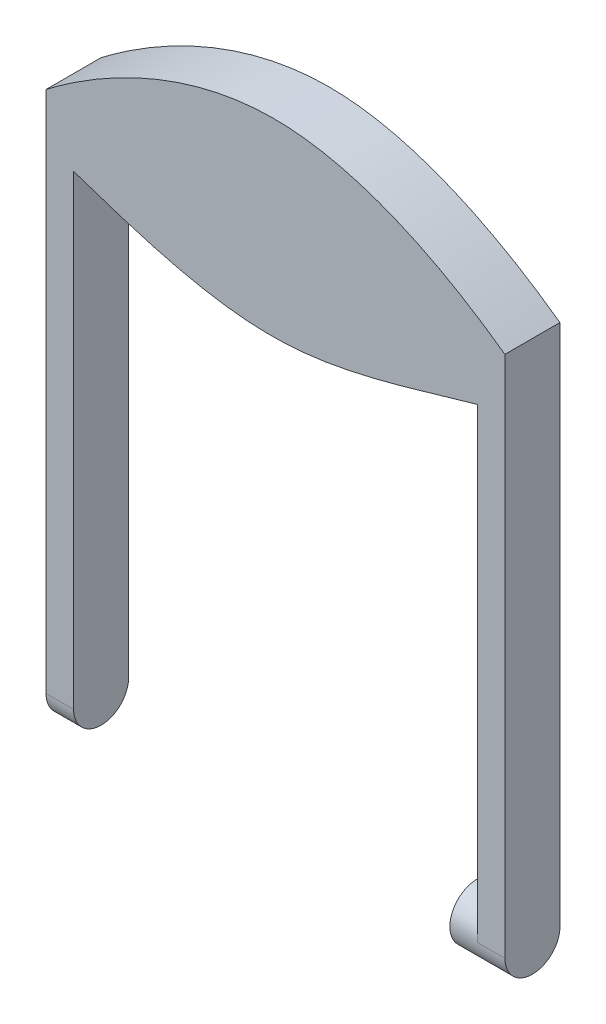
ISO-10303-21;
HEADER;
FILE_DESCRIPTION(('STEP AP214'),'2;1');
FILE_NAME('part.step','',(''),(''),'','','');
FILE_SCHEMA(('AUTOMOTIVE_DESIGN { 1 0 10303 214 1 1 1 1 }'));
ENDSEC;
DATA;
#1=APPLICATION_CONTEXT('core data for automotive mechanical design processes');
#2=APPLICATION_PROTOCOL_DEFINITION('international standard','automotive_design',2000,#1);
#3=PRODUCT_CONTEXT('',#1,'mechanical');
#4=PRODUCT('Part','Part','',(#3));
#5=PRODUCT_RELATED_PRODUCT_CATEGORY('part','',(#4));
#6=PRODUCT_DEFINITION_FORMATION('','',#4);
#7=PRODUCT_DEFINITION_CONTEXT('part definition',#1,'design');
#8=PRODUCT_DEFINITION('design','',#6,#7);
#9=PRODUCT_DEFINITION_SHAPE('','',#8);
#10=(LENGTH_UNIT() NAMED_UNIT(*) SI_UNIT(.MILLI.,.METRE.));
#11=(NAMED_UNIT(*) PLANE_ANGLE_UNIT() SI_UNIT($,.RADIAN.));
#12=(NAMED_UNIT(*) SI_UNIT($,.STERADIAN.) SOLID_ANGLE_UNIT());
#13=UNCERTAINTY_MEASURE_WITH_UNIT(LENGTH_MEASURE(1.E-05),#10,'distance_accuracy_value','');
#14=(GEOMETRIC_REPRESENTATION_CONTEXT(3) GLOBAL_UNCERTAINTY_ASSIGNED_CONTEXT((#13)) GLOBAL_UNIT_ASSIGNED_CONTEXT((#10,
#11,#12)) REPRESENTATION_CONTEXT('',''));
#15=CARTESIAN_POINT('',(0.,0.,0.));
#16=DIRECTION('',(0.,0.,1.));
#17=DIRECTION('',(1.,0.,0.));
#18=AXIS2_PLACEMENT_3D('',#15,#16,#17);
#19=CARTESIAN_POINT('',(2.99999999999999,53.7743661115804,6.));
#20=DIRECTION('',(-1.,0.,0.));
#21=DIRECTION('',(0.,-1.,0.));
#22=AXIS2_PLACEMENT_3D('',#19,#20,#21);
#23=PLANE('',#22);
#24=DIRECTION('',(0.,1.,0.));
#25=VECTOR('',#24,1.);
#26=CARTESIAN_POINT('',(2.99999999999999,53.7743661115804,6.));
#27=LINE('',#26,#25);
#28=CARTESIAN_POINT('',(3.,3.,6.));
#29=VERTEX_POINT('',#28);
#30=CARTESIAN_POINT('',(2.99999999999999,53.7743661115804,6.));
#31=VERTEX_POINT('',#30);
#32=EDGE_CURVE('E153',#29,#31,#27,.T.);
#33=ORIENTED_EDGE('',*,*,#32,.F.);
#34=CARTESIAN_POINT('',(3.,3.,3.));
#35=DIRECTION('',(-1.,0.,0.));
#36=DIRECTION('',(0.,-1.,0.));
#37=AXIS2_PLACEMENT_3D('',#34,#35,#36);
#38=CIRCLE('',#37,3.);
#39=CARTESIAN_POINT('',(3.,3.,0.));
#40=VERTEX_POINT('',#39);
#41=EDGE_CURVE('E110',#40,#29,#38,.T.);
#42=ORIENTED_EDGE('',*,*,#41,.F.);
#43=DIRECTION('',(0.,1.,0.));
#44=VECTOR('',#43,1.);
#45=CARTESIAN_POINT('',(2.99999999999999,53.7743661115804,0.));
#46=LINE('',#45,#44);
#47=CARTESIAN_POINT('',(2.99999999999999,53.7743661115804,0.));
#48=VERTEX_POINT('',#47);
#49=EDGE_CURVE('E133',#40,#48,#46,.T.);
#50=ORIENTED_EDGE('',*,*,#49,.T.);
#51=DIRECTION('',(0.,0.,-1.));
#52=VECTOR('',#51,1.);
#53=CARTESIAN_POINT('',(2.99999999999999,53.7743661115804,6.));
#54=LINE('',#53,#52);
#55=EDGE_CURVE('E160',#31,#48,#54,.T.);
#56=ORIENTED_EDGE('',*,*,#55,.F.);
#57=EDGE_LOOP('',(#33,#42,#50,#56));
#58=FACE_BOUND('',#57,.T.);
#59=ADVANCED_FACE('F38',(#58),#23,.F.);
#60=CARTESIAN_POINT('',(47.,0.,6.));
#61=DIRECTION('',(1.,0.,0.));
#62=DIRECTION('',(0.,0.,-1.));
#63=AXIS2_PLACEMENT_3D('',#60,#61,#62);
#64=PLANE('',#63);
#65=CARTESIAN_POINT('',(47.,3.,3.));
#66=DIRECTION('',(-1.,0.,0.));
#67=DIRECTION('',(0.,-1.,0.));
#68=AXIS2_PLACEMENT_3D('',#65,#66,#67);
#69=CIRCLE('',#68,3.);
#70=CARTESIAN_POINT('',(47.,3.,6.));
#71=VERTEX_POINT('',#70);
#72=CARTESIAN_POINT('',(47.,3.,0.));
#73=VERTEX_POINT('',#72);
#74=EDGE_CURVE('E55',#71,#73,#69,.T.);
#75=ORIENTED_EDGE('',*,*,#74,.F.);
#76=DIRECTION('',(0.,-1.,0.));
#77=VECTOR('',#76,1.);
#78=CARTESIAN_POINT('',(47.,0.,6.));
#79=LINE('',#78,#77);
#80=CARTESIAN_POINT('',(47.,53.7743661115804,6.));
#81=VERTEX_POINT('',#80);
#82=EDGE_CURVE('E182',#81,#71,#79,.T.);
#83=ORIENTED_EDGE('',*,*,#82,.F.);
#84=DIRECTION('',(0.,0.,-1.));
#85=VECTOR('',#84,1.);
#86=CARTESIAN_POINT('',(47.,53.7743661115804,6.));
#87=LINE('',#86,#85);
#88=CARTESIAN_POINT('',(47.,53.7743661115804,0.));
#89=VERTEX_POINT('',#88);
#90=EDGE_CURVE('E157',#81,#89,#87,.T.);
#91=ORIENTED_EDGE('',*,*,#90,.T.);
#92=DIRECTION('',(0.,-1.,0.));
#93=VECTOR('',#92,1.);
#94=CARTESIAN_POINT('',(47.,0.,0.));
#95=LINE('',#94,#93);
#96=EDGE_CURVE('E139',#89,#73,#95,.T.);
#97=ORIENTED_EDGE('',*,*,#96,.T.);
#98=EDGE_LOOP('',(#75,#83,#91,#97));
#99=FACE_BOUND('',#98,.T.);
#100=ADVANCED_FACE('F191',(#99),#64,.F.);
#101=CARTESIAN_POINT('',(50.,60.,6.));
#102=DIRECTION('',(-1.,0.,0.));
#103=DIRECTION('',(0.,-1.,0.));
#104=AXIS2_PLACEMENT_3D('',#101,#102,#103);
#105=PLANE('',#104);
#106=DIRECTION('',(0.,1.,0.));
#107=VECTOR('',#106,1.);
#108=CARTESIAN_POINT('',(50.,60.,6.));
#109=LINE('',#108,#107);
#110=CARTESIAN_POINT('',(50.,3.,6.));
#111=VERTEX_POINT('',#110);
#112=CARTESIAN_POINT('',(50.,60.,6.));
#113=VERTEX_POINT('',#112);
#114=EDGE_CURVE('E126',#111,#113,#109,.T.);
#115=ORIENTED_EDGE('',*,*,#114,.F.);
#116=CARTESIAN_POINT('',(50.,3.,3.));
#117=DIRECTION('',(-1.,0.,0.));
#118=DIRECTION('',(0.,0.,1.));
#119=AXIS2_PLACEMENT_3D('',#116,#117,#118);
#120=CIRCLE('',#119,3.);
#121=CARTESIAN_POINT('',(50.,3.,0.));
#122=VERTEX_POINT('',#121);
#123=EDGE_CURVE('E325',#122,#111,#120,.T.);
#124=ORIENTED_EDGE('',*,*,#123,.F.);
#125=DIRECTION('',(0.,1.,0.));
#126=VECTOR('',#125,1.);
#127=CARTESIAN_POINT('',(50.,60.,0.));
#128=LINE('',#127,#126);
#129=CARTESIAN_POINT('',(50.,60.,0.));
#130=VERTEX_POINT('',#129);
#131=EDGE_CURVE('E144',#122,#130,#128,.T.);
#132=ORIENTED_EDGE('',*,*,#131,.T.);
#133=DIRECTION('',(0.,0.,-1.));
#134=VECTOR('',#133,1.);
#135=CARTESIAN_POINT('',(50.,60.,6.));
#136=LINE('',#135,#134);
#137=EDGE_CURVE('E124',#113,#130,#136,.T.);
#138=ORIENTED_EDGE('',*,*,#137,.F.);
#139=EDGE_LOOP('',(#115,#124,#132,#138));
#140=FACE_BOUND('',#139,.T.);
#141=ADVANCED_FACE('F194',(#140),#105,.F.);
#142=CARTESIAN_POINT('',(0.,0.,6.));
#143=DIRECTION('',(1.,0.,0.));
#144=DIRECTION('',(0.,0.,-1.));
#145=AXIS2_PLACEMENT_3D('',#142,#143,#144);
#146=PLANE('',#145);
#147=CARTESIAN_POINT('',(0.,3.,3.));
#148=DIRECTION('',(-1.,0.,0.));
#149=DIRECTION('',(0.,0.,1.));
#150=AXIS2_PLACEMENT_3D('',#147,#148,#149);
#151=CIRCLE('',#150,3.);
#152=CARTESIAN_POINT('',(0.,3.,0.));
#153=VERTEX_POINT('',#152);
#154=CARTESIAN_POINT('',(0.,3.,6.));
#155=VERTEX_POINT('',#154);
#156=EDGE_CURVE('E41',#153,#155,#151,.T.);
#157=ORIENTED_EDGE('',*,*,#156,.T.);
#158=DIRECTION('',(0.,-1.,0.));
#159=VECTOR('',#158,1.);
#160=CARTESIAN_POINT('',(0.,0.,6.));
#161=LINE('',#160,#159);
#162=CARTESIAN_POINT('',(0.,60.,6.));
#163=VERTEX_POINT('',#162);
#164=EDGE_CURVE('E105',#163,#155,#161,.T.);
#165=ORIENTED_EDGE('',*,*,#164,.F.);
#166=DIRECTION('',(0.,0.,-1.));
#167=VECTOR('',#166,1.);
#168=CARTESIAN_POINT('',(0.,60.,6.));
#169=LINE('',#168,#167);
#170=CARTESIAN_POINT('',(0.,60.,0.));
#171=VERTEX_POINT('',#170);
#172=EDGE_CURVE('E122',#163,#171,#169,.T.);
#173=ORIENTED_EDGE('',*,*,#172,.T.);
#174=DIRECTION('',(0.,-1.,0.));
#175=VECTOR('',#174,1.);
#176=CARTESIAN_POINT('',(0.,0.,0.));
#177=LINE('',#176,#175);
#178=EDGE_CURVE('E107',#171,#153,#177,.T.);
#179=ORIENTED_EDGE('',*,*,#178,.T.);
#180=EDGE_LOOP('',(#157,#165,#173,#179));
#181=FACE_BOUND('',#180,.T.);
#182=ADVANCED_FACE('F102',(#181),#146,.F.);
#183=CARTESIAN_POINT('',(2.99999999999999,53.7743661115804,6.));
#184=CARTESIAN_POINT('',(9.9658666921587,51.4057335745869,6.));
#185=CARTESIAN_POINT('',(25.0334848628172,46.4505299558585,6.));
#186=CARTESIAN_POINT('',(39.925766488175,51.8138751437429,6.));
#187=CARTESIAN_POINT('',(47.,53.7743661115804,6.));
#188=B_SPLINE_CURVE_WITH_KNOTS('',3,(#183,#184,#185,#186,#187),.UNSPECIFIED.,.F.,.F.,(4,1,4),
(0.,0.500345438219116,1.),.UNSPECIFIED.);
#189=DIRECTION('',(0.,0.,-1.));
#190=VECTOR('',#189,1.);
#191=SURFACE_OF_LINEAR_EXTRUSION('',#188,#190);
#192=CARTESIAN_POINT('',(2.99999999999999,53.7743661115804,0.));
#193=CARTESIAN_POINT('',(9.9658666921587,51.4057335745869,0.));
#194=CARTESIAN_POINT('',(25.0334848628172,46.4505299558585,0.));
#195=CARTESIAN_POINT('',(39.925766488175,51.8138751437429,0.));
#196=CARTESIAN_POINT('',(47.,53.7743661115804,0.));
#197=B_SPLINE_CURVE_WITH_KNOTS('',3,(#192,#193,#194,#195,#196),.UNSPECIFIED.,.F.,.F.,(4,1,4),
(0.,0.500345438219116,1.),.UNSPECIFIED.);
#198=EDGE_CURVE('E135',#48,#89,#197,.T.);
#199=ORIENTED_EDGE('',*,*,#198,.T.);
#200=ORIENTED_EDGE('',*,*,#90,.F.);
#201=EDGE_CURVE('E177',#31,#81,#188,.T.);
#202=ORIENTED_EDGE('',*,*,#201,.F.);
#203=ORIENTED_EDGE('',*,*,#55,.T.);
#204=EDGE_LOOP('',(#199,#200,#202,#203));
#205=FACE_BOUND('',#204,.T.);
#206=ADVANCED_FACE('F186',(#205),#191,.F.);
#207=CARTESIAN_POINT('',(50.,60.,6.));
#208=CARTESIAN_POINT('',(42.9744478716073,65.0730648471077,6.));
#209=CARTESIAN_POINT('',(25.0215395180815,74.1373357794793,6.));
#210=CARTESIAN_POINT('',(6.93202701568276,65.3032680404069,6.));
#211=CARTESIAN_POINT('',(0.,60.,6.));
#212=B_SPLINE_CURVE_WITH_KNOTS('',3,(#207,#208,#209,#210,#211),.UNSPECIFIED.,.F.,.F.,(4,1,4),
(0.,0.499650091876115,1.),.UNSPECIFIED.);
#213=DIRECTION('',(0.,0.,-1.));
#214=VECTOR('',#213,1.);
#215=SURFACE_OF_LINEAR_EXTRUSION('',#212,#214);
#216=CARTESIAN_POINT('',(50.,60.,0.));
#217=CARTESIAN_POINT('',(42.9744478716073,65.0730648471077,0.));
#218=CARTESIAN_POINT('',(25.0215395180815,74.1373357794793,0.));
#219=CARTESIAN_POINT('',(6.93202701568276,65.3032680404069,0.));
#220=CARTESIAN_POINT('',(0.,60.,0.));
#221=B_SPLINE_CURVE_WITH_KNOTS('',3,(#216,#217,#218,#219,#220),.UNSPECIFIED.,.F.,.F.,(4,1,4),
(0.,0.499650091876115,1.),.UNSPECIFIED.);
#222=EDGE_CURVE('E146',#130,#171,#221,.T.);
#223=ORIENTED_EDGE('',*,*,#222,.T.);
#224=ORIENTED_EDGE('',*,*,#172,.F.);
#225=EDGE_CURVE('E120',#113,#163,#212,.T.);
#226=ORIENTED_EDGE('',*,*,#225,.F.);
#227=ORIENTED_EDGE('',*,*,#137,.T.);
#228=EDGE_LOOP('',(#223,#224,#226,#227));
#229=FACE_BOUND('',#228,.T.);
#230=ADVANCED_FACE('F189',(#229),#215,.F.);
#231=CARTESIAN_POINT('',(24.9810826969435,69.6627891964369,6.));
#232=DIRECTION('',(0.,0.,1.));
#233=DIRECTION('',(1.,0.,0.));
#234=AXIS2_PLACEMENT_3D('',#231,#232,#233);
#235=PLANE('',#234);
#236=DIRECTION('',(-1.,0.,0.));
#237=VECTOR('',#236,1.);
#238=CARTESIAN_POINT('',(50.,3.,6.));
#239=LINE('',#238,#237);
#240=EDGE_CURVE('E318',#111,#71,#239,.T.);
#241=ORIENTED_EDGE('',*,*,#240,.F.);
#242=ORIENTED_EDGE('',*,*,#114,.T.);
#243=ORIENTED_EDGE('',*,*,#225,.T.);
#244=ORIENTED_EDGE('',*,*,#164,.T.);
#245=DIRECTION('',(-1.,0.,0.));
#246=VECTOR('',#245,1.);
#247=CARTESIAN_POINT('',(50.,3.,6.));
#248=LINE('',#247,#246);
#249=EDGE_CURVE('E12',#29,#155,#248,.T.);
#250=ORIENTED_EDGE('',*,*,#249,.F.);
#251=ORIENTED_EDGE('',*,*,#32,.T.);
#252=ORIENTED_EDGE('',*,*,#201,.T.);
#253=ORIENTED_EDGE('',*,*,#82,.T.);
#254=EDGE_LOOP('',(#241,#242,#243,#244,#250,#251,#252,#253));
#255=FACE_BOUND('',#254,.T.);
#256=ADVANCED_FACE('F118',(#255),#235,.T.);
#257=CARTESIAN_POINT('',(24.9810826969435,69.6627891964369,0.));
#258=DIRECTION('',(0.,0.,1.));
#259=DIRECTION('',(1.,0.,0.));
#260=AXIS2_PLACEMENT_3D('',#257,#258,#259);
#261=PLANE('',#260);
#262=ORIENTED_EDGE('',*,*,#131,.F.);
#263=DIRECTION('',(-1.,0.,0.));
#264=VECTOR('',#263,1.);
#265=CARTESIAN_POINT('',(50.,3.,0.));
#266=LINE('',#265,#264);
#267=EDGE_CURVE('E111',#122,#73,#266,.T.);
#268=ORIENTED_EDGE('',*,*,#267,.T.);
#269=ORIENTED_EDGE('',*,*,#96,.F.);
#270=ORIENTED_EDGE('',*,*,#198,.F.);
#271=ORIENTED_EDGE('',*,*,#49,.F.);
#272=DIRECTION('',(-1.,0.,0.));
#273=VECTOR('',#272,1.);
#274=CARTESIAN_POINT('',(50.,3.,0.));
#275=LINE('',#274,#273);
#276=EDGE_CURVE('E47',#40,#153,#275,.T.);
#277=ORIENTED_EDGE('',*,*,#276,.T.);
#278=ORIENTED_EDGE('',*,*,#178,.F.);
#279=ORIENTED_EDGE('',*,*,#222,.F.);
#280=EDGE_LOOP('',(#262,#268,#269,#270,#271,#277,#278,#279));
#281=FACE_BOUND('',#280,.T.);
#282=ADVANCED_FACE('F166',(#281),#261,.F.);
#283=CARTESIAN_POINT('',(50.,3.,3.));
#284=DIRECTION('',(-1.,0.,0.));
#285=DIRECTION('',(0.,0.,1.));
#286=AXIS2_PLACEMENT_3D('',#283,#284,#285);
#287=CYLINDRICAL_SURFACE('',#286,3.);
#288=ORIENTED_EDGE('',*,*,#41,.T.);
#289=ORIENTED_EDGE('',*,*,#249,.T.);
#290=ORIENTED_EDGE('',*,*,#156,.F.);
#291=ORIENTED_EDGE('',*,*,#276,.F.);
#292=EDGE_LOOP('',(#288,#289,#290,#291));
#293=FACE_BOUND('',#292,.T.);
#294=ADVANCED_FACE('F113',(#293),#287,.T.);
#295=ORIENTED_EDGE('',*,*,#240,.T.);
#296=ORIENTED_EDGE('',*,*,#74,.T.);
#297=ORIENTED_EDGE('',*,*,#267,.F.);
#298=ORIENTED_EDGE('',*,*,#123,.T.);
#299=EDGE_LOOP('',(#295,#296,#297,#298));
#300=FACE_BOUND('',#299,.T.);
#301=CARTESIAN_POINT('',(44.,3.,3.));
#302=DIRECTION('',(-1.,0.,0.));
#303=DIRECTION('',(0.,-1.,0.));
#304=AXIS2_PLACEMENT_3D('',#301,#302,#303);
#305=CIRCLE('',#304,3.);
#306=CARTESIAN_POINT('',(44.,0.,3.));
#307=VERTEX_POINT('',#306);
#308=EDGE_CURVE('E322',#307,#307,#305,.T.);
#309=ORIENTED_EDGE('',*,*,#308,.F.);
#310=EDGE_LOOP('',(#309));
#311=FACE_BOUND('',#310,.T.);
#312=ADVANCED_FACE('F210',(#300,#311),#287,.T.);
#313=CARTESIAN_POINT('',(44.,3.,3.));
#314=DIRECTION('',(1.,0.,0.));
#315=DIRECTION('',(0.,1.,0.));
#316=AXIS2_PLACEMENT_3D('',#313,#314,#315);
#317=CYLINDRICAL_SURFACE('',#316,2.05);
#318=CARTESIAN_POINT('',(44.,3.,3.));
#319=DIRECTION('',(-1.,0.,0.));
#320=DIRECTION('',(0.,-1.,0.));
#321=AXIS2_PLACEMENT_3D('',#318,#319,#320);
#322=CIRCLE('',#321,2.05);
#323=CARTESIAN_POINT('',(44.,0.949999999999996,3.));
#324=VERTEX_POINT('',#323);
#325=EDGE_CURVE('E323',#324,#324,#322,.T.);
#326=ORIENTED_EDGE('',*,*,#325,.T.);
#327=EDGE_LOOP('',(#326));
#328=FACE_BOUND('',#327,.T.);
#329=CARTESIAN_POINT('',(47.,3.,3.));
#330=DIRECTION('',(-1.,0.,0.));
#331=DIRECTION('',(0.,-1.,0.));
#332=AXIS2_PLACEMENT_3D('',#329,#330,#331);
#333=CIRCLE('',#332,2.05);
#334=CARTESIAN_POINT('',(47.,0.949999999999996,3.));
#335=VERTEX_POINT('',#334);
#336=EDGE_CURVE('E330',#335,#335,#333,.T.);
#337=ORIENTED_EDGE('',*,*,#336,.F.);
#338=EDGE_LOOP('',(#337));
#339=FACE_BOUND('',#338,.T.);
#340=ADVANCED_FACE('F211',(#328,#339),#317,.F.);
#341=CARTESIAN_POINT('',(44.,0.,0.));
#342=DIRECTION('',(-1.,0.,0.));
#343=DIRECTION('',(0.,-1.,0.));
#344=AXIS2_PLACEMENT_3D('',#341,#342,#343);
#345=PLANE('',#344);
#346=ORIENTED_EDGE('',*,*,#325,.F.);
#347=EDGE_LOOP('',(#346));
#348=FACE_BOUND('',#347,.T.);
#349=ORIENTED_EDGE('',*,*,#308,.T.);
#350=EDGE_LOOP('',(#349));
#351=FACE_BOUND('',#350,.T.);
#352=ADVANCED_FACE('F214',(#348,#351),#345,.T.);
#353=ORIENTED_EDGE('',*,*,#336,.T.);
#354=EDGE_LOOP('',(#353));
#355=FACE_BOUND('',#354,.T.);
#356=ADVANCED_FACE('F195',(#355),#64,.F.);
#357=CLOSED_SHELL('',(#59,#100,#141,#182,#206,#230,#256,#282,#294,#312,#340,#352,#356));
#358=MANIFOLD_SOLID_BREP('B2',#357);
#359=ADVANCED_BREP_SHAPE_REPRESENTATION('',(#18,#358),#14);
#360=SHAPE_DEFINITION_REPRESENTATION(#9,#359);
ENDSEC;
END-ISO-10303-21;
